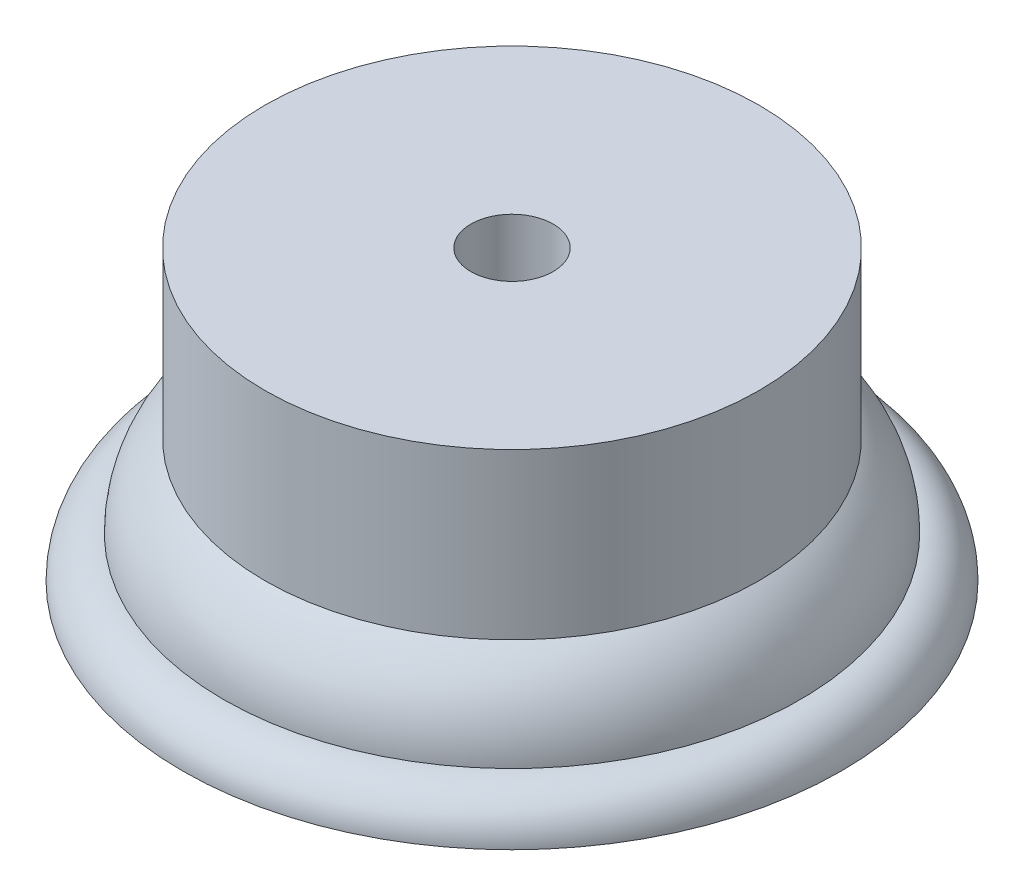
ISO-10303-21;
HEADER;
FILE_DESCRIPTION(('STEP AP214'),'2;1');
FILE_NAME('part.step','',(''),(''),'','','');
FILE_SCHEMA(('AUTOMOTIVE_DESIGN { 1 0 10303 214 1 1 1 1 }'));
ENDSEC;
DATA;
#1=APPLICATION_CONTEXT('core data for automotive mechanical design processes');
#2=APPLICATION_PROTOCOL_DEFINITION('international standard','automotive_design',2000,#1);
#3=PRODUCT_CONTEXT('',#1,'mechanical');
#4=PRODUCT('Part','Part','',(#3));
#5=PRODUCT_RELATED_PRODUCT_CATEGORY('part','',(#4));
#6=PRODUCT_DEFINITION_FORMATION('','',#4);
#7=PRODUCT_DEFINITION_CONTEXT('part definition',#1,'design');
#8=PRODUCT_DEFINITION('design','',#6,#7);
#9=PRODUCT_DEFINITION_SHAPE('','',#8);
#10=(LENGTH_UNIT() NAMED_UNIT(*) SI_UNIT(.MILLI.,.METRE.));
#11=(NAMED_UNIT(*) PLANE_ANGLE_UNIT() SI_UNIT($,.RADIAN.));
#12=(NAMED_UNIT(*) SI_UNIT($,.STERADIAN.) SOLID_ANGLE_UNIT());
#13=UNCERTAINTY_MEASURE_WITH_UNIT(LENGTH_MEASURE(1.E-05),#10,'distance_accuracy_value','');
#14=(GEOMETRIC_REPRESENTATION_CONTEXT(3) GLOBAL_UNCERTAINTY_ASSIGNED_CONTEXT((#13)) GLOBAL_UNIT_ASSIGNED_CONTEXT((#10,
#11,#12)) REPRESENTATION_CONTEXT('',''));
#15=CARTESIAN_POINT('',(0.,0.,0.));
#16=DIRECTION('',(0.,0.,1.));
#17=DIRECTION('',(1.,0.,0.));
#18=AXIS2_PLACEMENT_3D('',#15,#16,#17);
#19=CARTESIAN_POINT('',(0.,0.,0.));
#20=DIRECTION('',(0.,1.,0.));
#21=DIRECTION('',(0.,0.,1.));
#22=AXIS2_PLACEMENT_3D('',#19,#20,#21);
#23=PLANE('',#22);
#24=CARTESIAN_POINT('',(0.,0.,0.));
#25=DIRECTION('',(0.,1.,0.));
#26=DIRECTION('',(0.,0.,1.));
#27=AXIS2_PLACEMENT_3D('',#24,#25,#26);
#28=CIRCLE('',#27,1.);
#29=CARTESIAN_POINT('',(0.,0.,1.));
#30=VERTEX_POINT('',#29);
#31=EDGE_CURVE('E49',#30,#30,#28,.T.);
#32=ORIENTED_EDGE('',*,*,#31,.T.);
#33=EDGE_LOOP('',(#32));
#34=FACE_BOUND('',#33,.T.);
#35=CARTESIAN_POINT('',(0.,0.,0.));
#36=DIRECTION('',(0.,1.,0.));
#37=DIRECTION('',(0.,0.,1.));
#38=AXIS2_PLACEMENT_3D('',#35,#36,#37);
#39=CIRCLE('',#38,8.);
#40=CARTESIAN_POINT('',(0.,0.,8.));
#41=VERTEX_POINT('',#40);
#42=EDGE_CURVE('E10',#41,#41,#39,.T.);
#43=ORIENTED_EDGE('',*,*,#42,.F.);
#44=EDGE_LOOP('',(#43));
#45=FACE_BOUND('',#44,.T.);
#46=ADVANCED_FACE('F30',(#34,#45),#23,.F.);
#47=CARTESIAN_POINT('',(0.,7.,0.));
#48=DIRECTION('',(0.,-1.,0.));
#49=DIRECTION('',(0.,0.,-1.));
#50=AXIS2_PLACEMENT_3D('',#47,#48,#49);
#51=CYLINDRICAL_SURFACE('',#50,6.);
#52=CARTESIAN_POINT('',(0.,7.,0.));
#53=DIRECTION('',(0.,1.,0.));
#54=DIRECTION('',(0.,0.,1.));
#55=AXIS2_PLACEMENT_3D('',#52,#53,#54);
#56=CIRCLE('',#55,6.);
#57=CARTESIAN_POINT('',(0.,7.,6.));
#58=VERTEX_POINT('',#57);
#59=EDGE_CURVE('E41',#58,#58,#56,.T.);
#60=ORIENTED_EDGE('',*,*,#59,.F.);
#61=EDGE_LOOP('',(#60));
#62=FACE_BOUND('',#61,.T.);
#63=CARTESIAN_POINT('',(0.,3.,0.));
#64=DIRECTION('',(0.,1.,0.));
#65=DIRECTION('',(0.,0.,1.));
#66=AXIS2_PLACEMENT_3D('',#63,#64,#65);
#67=CIRCLE('',#66,6.);
#68=CARTESIAN_POINT('',(0.,3.,6.));
#69=VERTEX_POINT('',#68);
#70=EDGE_CURVE('E45',#69,#69,#67,.T.);
#71=ORIENTED_EDGE('',*,*,#70,.T.);
#72=EDGE_LOOP('',(#71));
#73=FACE_BOUND('',#72,.T.);
#74=ADVANCED_FACE('F63',(#62,#73),#51,.T.);
#75=CARTESIAN_POINT('',(0.,7.,0.));
#76=DIRECTION('',(0.,1.,0.));
#77=DIRECTION('',(0.,0.,1.));
#78=AXIS2_PLACEMENT_3D('',#75,#76,#77);
#79=PLANE('',#78);
#80=CARTESIAN_POINT('',(0.,7.,0.));
#81=DIRECTION('',(0.,1.,0.));
#82=DIRECTION('',(0.,0.,1.));
#83=AXIS2_PLACEMENT_3D('',#80,#81,#82);
#84=CIRCLE('',#83,1.);
#85=CARTESIAN_POINT('',(0.,7.,1.));
#86=VERTEX_POINT('',#85);
#87=EDGE_CURVE('E53',#86,#86,#84,.T.);
#88=ORIENTED_EDGE('',*,*,#87,.F.);
#89=EDGE_LOOP('',(#88));
#90=FACE_BOUND('',#89,.T.);
#91=ORIENTED_EDGE('',*,*,#59,.T.);
#92=EDGE_LOOP('',(#91));
#93=FACE_BOUND('',#92,.T.);
#94=ADVANCED_FACE('F60',(#90,#93),#79,.T.);
#95=CARTESIAN_POINT('',(0.,-17.,0.));
#96=DIRECTION('',(0.,1.,0.));
#97=DIRECTION('',(0.,0.,1.));
#98=AXIS2_PLACEMENT_3D('',#95,#96,#97);
#99=CYLINDRICAL_SURFACE('',#98,1.);
#100=ORIENTED_EDGE('',*,*,#87,.T.);
#101=EDGE_LOOP('',(#100));
#102=FACE_BOUND('',#101,.T.);
#103=ORIENTED_EDGE('',*,*,#31,.F.);
#104=EDGE_LOOP('',(#103));
#105=FACE_BOUND('',#104,.T.);
#106=ADVANCED_FACE('F57',(#102,#105),#99,.F.);
#107=CARTESIAN_POINT('',(0.,0.,0.));
#108=DIRECTION('',(0.,1.,0.));
#109=DIRECTION('',(0.,0.,1.));
#110=AXIS2_PLACEMENT_3D('',#107,#108,#109);
#111=TOROIDAL_SURFACE('',#110,7.,1.);
#112=ORIENTED_EDGE('',*,*,#42,.T.);
#113=EDGE_LOOP('',(#112));
#114=FACE_BOUND('',#113,.T.);
#115=CARTESIAN_POINT('',(0.,1.,0.));
#116=DIRECTION('',(0.,1.,0.));
#117=DIRECTION('',(0.,0.,1.));
#118=AXIS2_PLACEMENT_3D('',#115,#116,#117);
#119=CIRCLE('',#118,7.);
#120=CARTESIAN_POINT('',(0.,1.,7.));
#121=VERTEX_POINT('',#120);
#122=EDGE_CURVE('E37',#121,#121,#119,.T.);
#123=ORIENTED_EDGE('',*,*,#122,.F.);
#124=EDGE_LOOP('',(#123));
#125=FACE_BOUND('',#124,.T.);
#126=ADVANCED_FACE('F73',(#114,#125),#111,.T.);
#127=CARTESIAN_POINT('',(0.,1.,0.));
#128=DIRECTION('',(0.,1.,0.));
#129=DIRECTION('',(0.,0.,1.));
#130=AXIS2_PLACEMENT_3D('',#127,#128,#129);
#131=TOROIDAL_SURFACE('',#130,4.5,2.5);
#132=ORIENTED_EDGE('',*,*,#122,.T.);
#133=EDGE_LOOP('',(#132));
#134=FACE_BOUND('',#133,.T.);
#135=ORIENTED_EDGE('',*,*,#70,.F.);
#136=EDGE_LOOP('',(#135));
#137=FACE_BOUND('',#136,.T.);
#138=ADVANCED_FACE('F32',(#134,#137),#131,.T.);
#139=CLOSED_SHELL('',(#46,#74,#94,#106,#126,#138));
#140=MANIFOLD_SOLID_BREP('B2',#139);
#141=ADVANCED_BREP_SHAPE_REPRESENTATION('',(#18,#140),#14);
#142=SHAPE_DEFINITION_REPRESENTATION(#9,#141);
ENDSEC;
END-ISO-10303-21;
